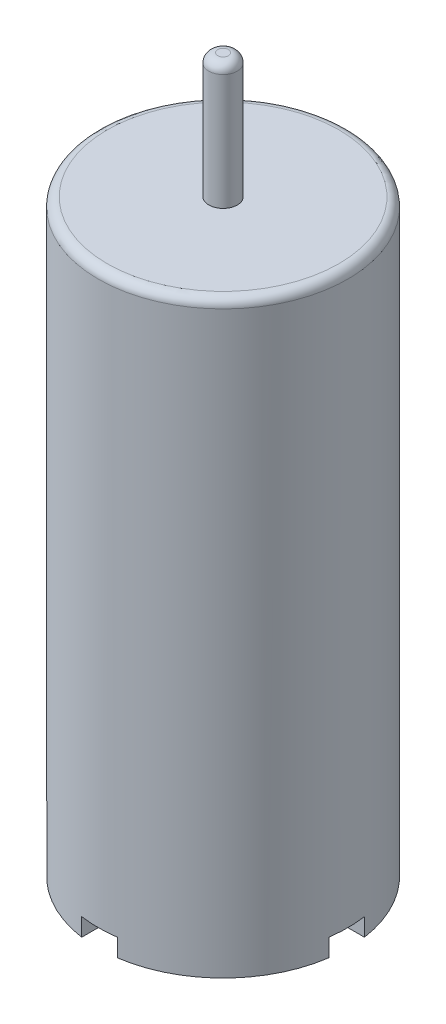
ISO-10303-21;
HEADER;
FILE_DESCRIPTION(('STEP AP214'),'2;1');
FILE_NAME('part.step','',(''),(''),'','','');
FILE_SCHEMA(('AUTOMOTIVE_DESIGN { 1 0 10303 214 1 1 1 1 }'));
ENDSEC;
DATA;
#1=APPLICATION_CONTEXT('core data for automotive mechanical design processes');
#2=APPLICATION_PROTOCOL_DEFINITION('international standard','automotive_design',2000,#1);
#3=PRODUCT_CONTEXT('',#1,'mechanical');
#4=PRODUCT('Part','Part','',(#3));
#5=PRODUCT_RELATED_PRODUCT_CATEGORY('part','',(#4));
#6=PRODUCT_DEFINITION_FORMATION('','',#4);
#7=PRODUCT_DEFINITION_CONTEXT('part definition',#1,'design');
#8=PRODUCT_DEFINITION('design','',#6,#7);
#9=PRODUCT_DEFINITION_SHAPE('','',#8);
#10=(LENGTH_UNIT() NAMED_UNIT(*) SI_UNIT(.MILLI.,.METRE.));
#11=(NAMED_UNIT(*) PLANE_ANGLE_UNIT() SI_UNIT($,.RADIAN.));
#12=(NAMED_UNIT(*) SI_UNIT($,.STERADIAN.) SOLID_ANGLE_UNIT());
#13=UNCERTAINTY_MEASURE_WITH_UNIT(LENGTH_MEASURE(1.E-05),#10,'distance_accuracy_value','');
#14=(GEOMETRIC_REPRESENTATION_CONTEXT(3) GLOBAL_UNCERTAINTY_ASSIGNED_CONTEXT((#13)) GLOBAL_UNIT_ASSIGNED_CONTEXT((#10,
#11,#12)) REPRESENTATION_CONTEXT('',''));
#15=CARTESIAN_POINT('',(0.,0.,0.));
#16=DIRECTION('',(0.,0.,1.));
#17=DIRECTION('',(1.,0.,0.));
#18=AXIS2_PLACEMENT_3D('',#15,#16,#17);
#19=CARTESIAN_POINT('',(0.,0.,0.));
#20=DIRECTION('',(0.,1.,0.));
#21=DIRECTION('',(0.,0.,1.));
#22=AXIS2_PLACEMENT_3D('',#19,#20,#21);
#23=PLANE('',#22);
#24=DIRECTION('',(0.,0.,1.));
#25=VECTOR('',#24,1.);
#26=CARTESIAN_POINT('',(-0.5,0.,2.96410161513775));
#27=LINE('',#26,#25);
#28=CARTESIAN_POINT('',(-0.5,0.,2.96410161513775));
#29=VERTEX_POINT('',#28);
#30=CARTESIAN_POINT('',(-0.5,0.,3.46410161513775));
#31=VERTEX_POINT('',#30);
#32=EDGE_CURVE('E51',#29,#31,#27,.T.);
#33=ORIENTED_EDGE('',*,*,#32,.F.);
#34=DIRECTION('',(-1.,0.,0.));
#35=VECTOR('',#34,1.);
#36=CARTESIAN_POINT('',(-0.5,0.,2.96410161513775));
#37=LINE('',#36,#35);
#38=CARTESIAN_POINT('',(0.5,0.,2.96410161513775));
#39=VERTEX_POINT('',#38);
#40=EDGE_CURVE('E55',#39,#29,#37,.T.);
#41=ORIENTED_EDGE('',*,*,#40,.F.);
#42=DIRECTION('',(0.,0.,-1.));
#43=VECTOR('',#42,1.);
#44=CARTESIAN_POINT('',(0.5,0.,2.96410161513775));
#45=LINE('',#44,#43);
#46=CARTESIAN_POINT('',(0.5,0.,3.46410161513775));
#47=VERTEX_POINT('',#46);
#48=EDGE_CURVE('E185',#47,#39,#45,.T.);
#49=ORIENTED_EDGE('',*,*,#48,.F.);
#50=CARTESIAN_POINT('',(0.,0.,0.));
#51=DIRECTION('',(0.,1.,0.));
#52=DIRECTION('',(0.,0.,1.));
#53=AXIS2_PLACEMENT_3D('',#50,#51,#52);
#54=CIRCLE('',#53,3.5);
#55=EDGE_CURVE('E170',#31,#47,#54,.T.);
#56=ORIENTED_EDGE('',*,*,#55,.F.);
#57=EDGE_LOOP('',(#33,#41,#49,#56));
#58=FACE_BOUND('',#57,.T.);
#59=ADVANCED_FACE('F36',(#58),#23,.F.);
#60=DIRECTION('',(1.,0.,0.));
#61=VECTOR('',#60,1.);
#62=CARTESIAN_POINT('',(2.96410161513776,0.,0.49999999999999));
#63=LINE('',#62,#61);
#64=CARTESIAN_POINT('',(2.96410161513776,0.,0.49999999999999));
#65=VERTEX_POINT('',#64);
#66=CARTESIAN_POINT('',(3.46410161513776,0.,0.499999999999988));
#67=VERTEX_POINT('',#66);
#68=EDGE_CURVE('E382',#65,#67,#63,.T.);
#69=ORIENTED_EDGE('',*,*,#68,.F.);
#70=DIRECTION('',(0.,0.,1.));
#71=VECTOR('',#70,1.);
#72=CARTESIAN_POINT('',(2.96410161513776,0.,0.49999999999999));
#73=LINE('',#72,#71);
#74=CARTESIAN_POINT('',(2.96410161513775,0.,-0.50000000000001));
#75=VERTEX_POINT('',#74);
#76=EDGE_CURVE('E358',#75,#65,#73,.T.);
#77=ORIENTED_EDGE('',*,*,#76,.F.);
#78=DIRECTION('',(-1.,0.,0.));
#79=VECTOR('',#78,1.);
#80=CARTESIAN_POINT('',(2.96410161513775,0.,-0.50000000000001));
#81=LINE('',#80,#79);
#82=CARTESIAN_POINT('',(3.46410161513775,0.,-0.500000000000012));
#83=VERTEX_POINT('',#82);
#84=EDGE_CURVE('E356',#83,#75,#81,.T.);
#85=ORIENTED_EDGE('',*,*,#84,.F.);
#86=EDGE_CURVE('E217',#67,#83,#54,.T.);
#87=ORIENTED_EDGE('',*,*,#86,.F.);
#88=EDGE_LOOP('',(#69,#77,#85,#87));
#89=FACE_BOUND('',#88,.T.);
#90=ADVANCED_FACE('F233',(#89),#23,.F.);
#91=DIRECTION('',(0.,0.,-1.));
#92=VECTOR('',#91,1.);
#93=CARTESIAN_POINT('',(0.49999999999998,0.,-2.96410161513776));
#94=LINE('',#93,#92);
#95=CARTESIAN_POINT('',(0.49999999999998,0.,-2.96410161513776));
#96=VERTEX_POINT('',#95);
#97=CARTESIAN_POINT('',(0.499999999999976,0.,-3.46410161513776));
#98=VERTEX_POINT('',#97);
#99=EDGE_CURVE('E341',#96,#98,#94,.T.);
#100=ORIENTED_EDGE('',*,*,#99,.F.);
#101=DIRECTION('',(1.,0.,0.));
#102=VECTOR('',#101,1.);
#103=CARTESIAN_POINT('',(0.49999999999998,0.,-2.96410161513776));
#104=LINE('',#103,#102);
#105=CARTESIAN_POINT('',(-0.500000000000021,0.,-2.96410161513775));
#106=VERTEX_POINT('',#105);
#107=EDGE_CURVE('E197',#106,#96,#104,.T.);
#108=ORIENTED_EDGE('',*,*,#107,.F.);
#109=DIRECTION('',(0.,0.,1.));
#110=VECTOR('',#109,1.);
#111=CARTESIAN_POINT('',(-0.500000000000021,0.,-2.96410161513775));
#112=LINE('',#111,#110);
#113=CARTESIAN_POINT('',(-0.500000000000024,0.,-3.46410161513775));
#114=VERTEX_POINT('',#113);
#115=EDGE_CURVE('E203',#114,#106,#112,.T.);
#116=ORIENTED_EDGE('',*,*,#115,.F.);
#117=EDGE_CURVE('E279',#98,#114,#54,.T.);
#118=ORIENTED_EDGE('',*,*,#117,.F.);
#119=EDGE_LOOP('',(#100,#108,#116,#118));
#120=FACE_BOUND('',#119,.T.);
#121=ADVANCED_FACE('F239',(#120),#23,.F.);
#122=DIRECTION('',(-1.,0.,0.));
#123=VECTOR('',#122,1.);
#124=CARTESIAN_POINT('',(-2.96410161513776,0.,-0.499999999999969));
#125=LINE('',#124,#123);
#126=CARTESIAN_POINT('',(-2.96410161513776,0.,-0.499999999999969));
#127=VERTEX_POINT('',#126);
#128=CARTESIAN_POINT('',(-3.46410161513776,0.,-0.499999999999964));
#129=VERTEX_POINT('',#128);
#130=EDGE_CURVE('E194',#127,#129,#125,.T.);
#131=ORIENTED_EDGE('',*,*,#130,.F.);
#132=DIRECTION('',(0.,0.,-1.));
#133=VECTOR('',#132,1.);
#134=CARTESIAN_POINT('',(-2.96410161513776,0.,-0.499999999999969));
#135=LINE('',#134,#133);
#136=CARTESIAN_POINT('',(-2.96410161513775,0.,0.500000000000031));
#137=VERTEX_POINT('',#136);
#138=EDGE_CURVE('E191',#137,#127,#135,.T.);
#139=ORIENTED_EDGE('',*,*,#138,.F.);
#140=DIRECTION('',(1.,0.,0.));
#141=VECTOR('',#140,1.);
#142=CARTESIAN_POINT('',(-2.96410161513775,0.,0.500000000000031));
#143=LINE('',#142,#141);
#144=CARTESIAN_POINT('',(-3.46410161513775,0.,0.500000000000036));
#145=VERTEX_POINT('',#144);
#146=EDGE_CURVE('E183',#145,#137,#143,.T.);
#147=ORIENTED_EDGE('',*,*,#146,.F.);
#148=EDGE_CURVE('E172',#129,#145,#54,.T.);
#149=ORIENTED_EDGE('',*,*,#148,.F.);
#150=EDGE_LOOP('',(#131,#139,#147,#149));
#151=FACE_BOUND('',#150,.T.);
#152=ADVANCED_FACE('F235',(#151),#23,.F.);
#153=CARTESIAN_POINT('',(0.,16.,0.));
#154=DIRECTION('',(0.,-1.,0.));
#155=DIRECTION('',(0.,0.,-1.));
#156=AXIS2_PLACEMENT_3D('',#153,#154,#155);
#157=CYLINDRICAL_SURFACE('',#156,3.5);
#158=CARTESIAN_POINT('',(0.,15.75,0.));
#159=DIRECTION('',(0.,1.,0.));
#160=DIRECTION('',(0.,0.,1.));
#161=AXIS2_PLACEMENT_3D('',#158,#159,#160);
#162=CIRCLE('',#161,3.5);
#163=CARTESIAN_POINT('',(0.,15.75,3.5));
#164=VERTEX_POINT('',#163);
#165=EDGE_CURVE('E216',#164,#164,#162,.F.);
#166=ORIENTED_EDGE('',*,*,#165,.T.);
#167=EDGE_LOOP('',(#166));
#168=FACE_BOUND('',#167,.T.);
#169=ORIENTED_EDGE('',*,*,#55,.T.);
#170=DIRECTION('',(0.,1.,0.));
#171=VECTOR('',#170,1.);
#172=CARTESIAN_POINT('',(0.5,-0.5,3.46410161513775));
#173=LINE('',#172,#171);
#174=CARTESIAN_POINT('',(0.5,-0.5,3.46410161513775));
#175=VERTEX_POINT('',#174);
#176=EDGE_CURVE('E313',#175,#47,#173,.T.);
#177=ORIENTED_EDGE('',*,*,#176,.F.);
#178=CARTESIAN_POINT('',(0.,-0.5,0.));
#179=DIRECTION('',(0.,-1.,0.));
#180=DIRECTION('',(0.,0.,-1.));
#181=AXIS2_PLACEMENT_3D('',#178,#179,#180);
#182=CIRCLE('',#181,3.5);
#183=CARTESIAN_POINT('',(3.46410161513776,-0.5,0.499999999999988));
#184=VERTEX_POINT('',#183);
#185=EDGE_CURVE('E305',#184,#175,#182,.T.);
#186=ORIENTED_EDGE('',*,*,#185,.F.);
#187=DIRECTION('',(0.,1.,0.));
#188=VECTOR('',#187,1.);
#189=CARTESIAN_POINT('',(3.46410161513776,-0.5,0.499999999999988));
#190=LINE('',#189,#188);
#191=EDGE_CURVE('E322',#184,#67,#190,.T.);
#192=ORIENTED_EDGE('',*,*,#191,.T.);
#193=ORIENTED_EDGE('',*,*,#86,.T.);
#194=DIRECTION('',(0.,1.,0.));
#195=VECTOR('',#194,1.);
#196=CARTESIAN_POINT('',(3.46410161513775,-0.5,-0.500000000000012));
#197=LINE('',#196,#195);
#198=CARTESIAN_POINT('',(3.46410161513775,-0.5,-0.500000000000012));
#199=VERTEX_POINT('',#198);
#200=EDGE_CURVE('E324',#199,#83,#197,.T.);
#201=ORIENTED_EDGE('',*,*,#200,.F.);
#202=CARTESIAN_POINT('',(0.,-0.5,0.));
#203=DIRECTION('',(0.,-1.,0.));
#204=DIRECTION('',(0.,0.,-1.));
#205=AXIS2_PLACEMENT_3D('',#202,#203,#204);
#206=CIRCLE('',#205,3.5);
#207=CARTESIAN_POINT('',(0.499999999999976,-0.5,-3.46410161513776));
#208=VERTEX_POINT('',#207);
#209=EDGE_CURVE('E297',#208,#199,#206,.T.);
#210=ORIENTED_EDGE('',*,*,#209,.F.);
#211=DIRECTION('',(0.,1.,0.));
#212=VECTOR('',#211,1.);
#213=CARTESIAN_POINT('',(0.499999999999976,-0.5,-3.46410161513776));
#214=LINE('',#213,#212);
#215=EDGE_CURVE('E327',#208,#98,#214,.T.);
#216=ORIENTED_EDGE('',*,*,#215,.T.);
#217=ORIENTED_EDGE('',*,*,#117,.T.);
#218=DIRECTION('',(0.,1.,0.));
#219=VECTOR('',#218,1.);
#220=CARTESIAN_POINT('',(-0.500000000000024,-0.5,-3.46410161513775));
#221=LINE('',#220,#219);
#222=CARTESIAN_POINT('',(-0.500000000000024,-0.5,-3.46410161513775));
#223=VERTEX_POINT('',#222);
#224=EDGE_CURVE('E210',#223,#114,#221,.T.);
#225=ORIENTED_EDGE('',*,*,#224,.F.);
#226=CARTESIAN_POINT('',(0.,-0.5,0.));
#227=DIRECTION('',(0.,-1.,0.));
#228=DIRECTION('',(0.,0.,-1.));
#229=AXIS2_PLACEMENT_3D('',#226,#227,#228);
#230=CIRCLE('',#229,3.5);
#231=CARTESIAN_POINT('',(-3.46410161513776,-0.5,-0.499999999999964));
#232=VERTEX_POINT('',#231);
#233=EDGE_CURVE('E289',#232,#223,#230,.T.);
#234=ORIENTED_EDGE('',*,*,#233,.F.);
#235=DIRECTION('',(0.,1.,0.));
#236=VECTOR('',#235,1.);
#237=CARTESIAN_POINT('',(-3.46410161513776,-0.5,-0.499999999999964));
#238=LINE('',#237,#236);
#239=EDGE_CURVE('E206',#232,#129,#238,.T.);
#240=ORIENTED_EDGE('',*,*,#239,.T.);
#241=ORIENTED_EDGE('',*,*,#148,.T.);
#242=DIRECTION('',(0.,1.,0.));
#243=VECTOR('',#242,1.);
#244=CARTESIAN_POINT('',(-3.46410161513775,-0.5,0.500000000000036));
#245=LINE('',#244,#243);
#246=CARTESIAN_POINT('',(-3.46410161513775,-0.5,0.500000000000036));
#247=VERTEX_POINT('',#246);
#248=EDGE_CURVE('E155',#247,#145,#245,.T.);
#249=ORIENTED_EDGE('',*,*,#248,.F.);
#250=CARTESIAN_POINT('',(0.,-0.5,0.));
#251=DIRECTION('',(0.,-1.,0.));
#252=DIRECTION('',(0.,0.,-1.));
#253=AXIS2_PLACEMENT_3D('',#250,#251,#252);
#254=CIRCLE('',#253,3.5);
#255=CARTESIAN_POINT('',(-0.5,-0.5,3.46410161513776));
#256=VERTEX_POINT('',#255);
#257=EDGE_CURVE('E147',#256,#247,#254,.T.);
#258=ORIENTED_EDGE('',*,*,#257,.F.);
#259=DIRECTION('',(0.,1.,0.));
#260=VECTOR('',#259,1.);
#261=CARTESIAN_POINT('',(-0.5,-0.5,3.46410161513776));
#262=LINE('',#261,#260);
#263=EDGE_CURVE('E152',#256,#31,#262,.T.);
#264=ORIENTED_EDGE('',*,*,#263,.T.);
#265=EDGE_LOOP('',(#169,#177,#186,#192,#193,#201,#210,#216,#217,#225,#234,#240,#241,#249,#258,#264));
#266=FACE_BOUND('',#265,.T.);
#267=ADVANCED_FACE('F150',(#168,#266),#157,.T.);
#268=CARTESIAN_POINT('',(0.,16.,0.));
#269=DIRECTION('',(0.,1.,0.));
#270=DIRECTION('',(0.,0.,1.));
#271=AXIS2_PLACEMENT_3D('',#268,#269,#270);
#272=PLANE('',#271);
#273=CARTESIAN_POINT('',(0.,16.,0.));
#274=DIRECTION('',(0.,1.,0.));
#275=DIRECTION('',(0.,0.,1.));
#276=AXIS2_PLACEMENT_3D('',#273,#274,#275);
#277=CIRCLE('',#276,3.25);
#278=CARTESIAN_POINT('',(0.,16.,3.25));
#279=VERTEX_POINT('',#278);
#280=EDGE_CURVE('E213',#279,#279,#277,.T.);
#281=ORIENTED_EDGE('',*,*,#280,.T.);
#282=EDGE_LOOP('',(#281));
#283=FACE_BOUND('',#282,.T.);
#284=CARTESIAN_POINT('',(0.,16.,0.));
#285=DIRECTION('',(0.,1.,0.));
#286=DIRECTION('',(0.,0.,1.));
#287=AXIS2_PLACEMENT_3D('',#284,#285,#286);
#288=CIRCLE('',#287,0.4);
#289=CARTESIAN_POINT('',(0.,16.,0.4));
#290=VERTEX_POINT('',#289);
#291=EDGE_CURVE('E184',#290,#290,#288,.T.);
#292=ORIENTED_EDGE('',*,*,#291,.F.);
#293=EDGE_LOOP('',(#292));
#294=FACE_BOUND('',#293,.T.);
#295=ADVANCED_FACE('F249',(#283,#294),#272,.T.);
#296=CARTESIAN_POINT('',(-0.5,-0.5,2.96410161513775));
#297=DIRECTION('',(-1.,0.,0.));
#298=DIRECTION('',(0.,0.,1.));
#299=AXIS2_PLACEMENT_3D('',#296,#297,#298);
#300=PLANE('',#299);
#301=ORIENTED_EDGE('',*,*,#32,.T.);
#302=ORIENTED_EDGE('',*,*,#263,.F.);
#303=DIRECTION('',(0.,0.,1.));
#304=VECTOR('',#303,1.);
#305=CARTESIAN_POINT('',(-0.5,-0.5,2.96410161513775));
#306=LINE('',#305,#304);
#307=CARTESIAN_POINT('',(-0.5,-0.5,2.96410161513775));
#308=VERTEX_POINT('',#307);
#309=EDGE_CURVE('E159',#308,#256,#306,.T.);
#310=ORIENTED_EDGE('',*,*,#309,.F.);
#311=DIRECTION('',(0.,1.,0.));
#312=VECTOR('',#311,1.);
#313=CARTESIAN_POINT('',(-0.5,-0.5,2.96410161513775));
#314=LINE('',#313,#312);
#315=EDGE_CURVE('E309',#308,#29,#314,.T.);
#316=ORIENTED_EDGE('',*,*,#315,.T.);
#317=EDGE_LOOP('',(#301,#302,#310,#316));
#318=FACE_BOUND('',#317,.T.);
#319=ADVANCED_FACE('F169',(#318),#300,.F.);
#320=CARTESIAN_POINT('',(-2.96410161513775,-0.5,0.500000000000031));
#321=DIRECTION('',(0.,0.,1.));
#322=DIRECTION('',(1.,0.,0.));
#323=AXIS2_PLACEMENT_3D('',#320,#321,#322);
#324=PLANE('',#323);
#325=ORIENTED_EDGE('',*,*,#146,.T.);
#326=DIRECTION('',(0.,1.,0.));
#327=VECTOR('',#326,1.);
#328=CARTESIAN_POINT('',(-2.96410161513775,-0.5,0.500000000000031));
#329=LINE('',#328,#327);
#330=CARTESIAN_POINT('',(-2.96410161513775,-0.5,0.500000000000031));
#331=VERTEX_POINT('',#330);
#332=EDGE_CURVE('E174',#331,#137,#329,.T.);
#333=ORIENTED_EDGE('',*,*,#332,.F.);
#334=DIRECTION('',(1.,0.,0.));
#335=VECTOR('',#334,1.);
#336=CARTESIAN_POINT('',(-2.96410161513775,-0.5,0.500000000000031));
#337=LINE('',#336,#335);
#338=EDGE_CURVE('E158',#247,#331,#337,.T.);
#339=ORIENTED_EDGE('',*,*,#338,.F.);
#340=ORIENTED_EDGE('',*,*,#248,.T.);
#341=EDGE_LOOP('',(#325,#333,#339,#340));
#342=FACE_BOUND('',#341,.T.);
#343=ADVANCED_FACE('F283',(#342),#324,.F.);
#344=CARTESIAN_POINT('',(-2.96410161513776,-0.5,-0.499999999999969));
#345=DIRECTION('',(1.,0.,0.));
#346=DIRECTION('',(0.,0.,-1.));
#347=AXIS2_PLACEMENT_3D('',#344,#345,#346);
#348=PLANE('',#347);
#349=ORIENTED_EDGE('',*,*,#138,.T.);
#350=DIRECTION('',(0.,1.,0.));
#351=VECTOR('',#350,1.);
#352=CARTESIAN_POINT('',(-2.96410161513776,-0.5,-0.499999999999969));
#353=LINE('',#352,#351);
#354=CARTESIAN_POINT('',(-2.96410161513776,-0.5,-0.499999999999969));
#355=VERTEX_POINT('',#354);
#356=EDGE_CURVE('E209',#355,#127,#353,.T.);
#357=ORIENTED_EDGE('',*,*,#356,.F.);
#358=DIRECTION('',(0.,0.,-1.));
#359=VECTOR('',#358,1.);
#360=CARTESIAN_POINT('',(-2.96410161513776,-0.5,-0.499999999999969));
#361=LINE('',#360,#359);
#362=EDGE_CURVE('E284',#331,#355,#361,.T.);
#363=ORIENTED_EDGE('',*,*,#362,.F.);
#364=ORIENTED_EDGE('',*,*,#332,.T.);
#365=EDGE_LOOP('',(#349,#357,#363,#364));
#366=FACE_BOUND('',#365,.T.);
#367=ADVANCED_FACE('F259',(#366),#348,.F.);
#368=CARTESIAN_POINT('',(-2.96410161513776,-0.5,-0.499999999999969));
#369=DIRECTION('',(0.,0.,-1.));
#370=DIRECTION('',(-1.,0.,0.));
#371=AXIS2_PLACEMENT_3D('',#368,#369,#370);
#372=PLANE('',#371);
#373=ORIENTED_EDGE('',*,*,#130,.T.);
#374=ORIENTED_EDGE('',*,*,#239,.F.);
#375=DIRECTION('',(-1.,0.,0.));
#376=VECTOR('',#375,1.);
#377=CARTESIAN_POINT('',(-2.96410161513776,-0.5,-0.499999999999969));
#378=LINE('',#377,#376);
#379=EDGE_CURVE('E264',#355,#232,#378,.T.);
#380=ORIENTED_EDGE('',*,*,#379,.F.);
#381=ORIENTED_EDGE('',*,*,#356,.T.);
#382=EDGE_LOOP('',(#373,#374,#380,#381));
#383=FACE_BOUND('',#382,.T.);
#384=ADVANCED_FACE('F263',(#383),#372,.F.);
#385=CARTESIAN_POINT('',(-0.500000000000021,-0.5,-2.96410161513775));
#386=DIRECTION('',(-1.,0.,0.));
#387=DIRECTION('',(0.,0.,1.));
#388=AXIS2_PLACEMENT_3D('',#385,#386,#387);
#389=PLANE('',#388);
#390=ORIENTED_EDGE('',*,*,#115,.T.);
#391=DIRECTION('',(0.,1.,0.));
#392=VECTOR('',#391,1.);
#393=CARTESIAN_POINT('',(-0.500000000000021,-0.5,-2.96410161513775));
#394=LINE('',#393,#392);
#395=CARTESIAN_POINT('',(-0.500000000000021,-0.5,-2.96410161513775));
#396=VERTEX_POINT('',#395);
#397=EDGE_CURVE('E268',#396,#106,#394,.T.);
#398=ORIENTED_EDGE('',*,*,#397,.F.);
#399=DIRECTION('',(0.,0.,1.));
#400=VECTOR('',#399,1.);
#401=CARTESIAN_POINT('',(-0.500000000000021,-0.5,-2.96410161513775));
#402=LINE('',#401,#400);
#403=EDGE_CURVE('E291',#223,#396,#402,.T.);
#404=ORIENTED_EDGE('',*,*,#403,.F.);
#405=ORIENTED_EDGE('',*,*,#224,.T.);
#406=EDGE_LOOP('',(#390,#398,#404,#405));
#407=FACE_BOUND('',#406,.T.);
#408=ADVANCED_FACE('F352',(#407),#389,.F.);
#409=CARTESIAN_POINT('',(0.49999999999998,-0.5,-2.96410161513776));
#410=DIRECTION('',(0.,0.,1.));
#411=DIRECTION('',(1.,0.,0.));
#412=AXIS2_PLACEMENT_3D('',#409,#410,#411);
#413=PLANE('',#412);
#414=ORIENTED_EDGE('',*,*,#107,.T.);
#415=DIRECTION('',(0.,1.,0.));
#416=VECTOR('',#415,1.);
#417=CARTESIAN_POINT('',(0.49999999999998,-0.5,-2.96410161513776));
#418=LINE('',#417,#416);
#419=CARTESIAN_POINT('',(0.49999999999998,-0.5,-2.96410161513776));
#420=VERTEX_POINT('',#419);
#421=EDGE_CURVE('E325',#420,#96,#418,.T.);
#422=ORIENTED_EDGE('',*,*,#421,.F.);
#423=DIRECTION('',(1.,0.,0.));
#424=VECTOR('',#423,1.);
#425=CARTESIAN_POINT('',(0.49999999999998,-0.5,-2.96410161513776));
#426=LINE('',#425,#424);
#427=EDGE_CURVE('E293',#396,#420,#426,.T.);
#428=ORIENTED_EDGE('',*,*,#427,.F.);
#429=ORIENTED_EDGE('',*,*,#397,.T.);
#430=EDGE_LOOP('',(#414,#422,#428,#429));
#431=FACE_BOUND('',#430,.T.);
#432=ADVANCED_FACE('F361',(#431),#413,.F.);
#433=CARTESIAN_POINT('',(0.49999999999998,-0.5,-2.96410161513776));
#434=DIRECTION('',(1.,0.,0.));
#435=DIRECTION('',(0.,0.,-1.));
#436=AXIS2_PLACEMENT_3D('',#433,#434,#435);
#437=PLANE('',#436);
#438=ORIENTED_EDGE('',*,*,#99,.T.);
#439=ORIENTED_EDGE('',*,*,#215,.F.);
#440=DIRECTION('',(0.,0.,-1.));
#441=VECTOR('',#440,1.);
#442=CARTESIAN_POINT('',(0.49999999999998,-0.5,-2.96410161513776));
#443=LINE('',#442,#441);
#444=EDGE_CURVE('E295',#420,#208,#443,.T.);
#445=ORIENTED_EDGE('',*,*,#444,.F.);
#446=ORIENTED_EDGE('',*,*,#421,.T.);
#447=EDGE_LOOP('',(#438,#439,#445,#446));
#448=FACE_BOUND('',#447,.T.);
#449=ADVANCED_FACE('F355',(#448),#437,.F.);
#450=CARTESIAN_POINT('',(2.96410161513775,-0.5,-0.50000000000001));
#451=DIRECTION('',(0.,0.,-1.));
#452=DIRECTION('',(-1.,0.,0.));
#453=AXIS2_PLACEMENT_3D('',#450,#451,#452);
#454=PLANE('',#453);
#455=ORIENTED_EDGE('',*,*,#84,.T.);
#456=DIRECTION('',(0.,1.,0.));
#457=VECTOR('',#456,1.);
#458=CARTESIAN_POINT('',(2.96410161513775,-0.5,-0.50000000000001));
#459=LINE('',#458,#457);
#460=CARTESIAN_POINT('',(2.96410161513775,-0.5,-0.50000000000001));
#461=VERTEX_POINT('',#460);
#462=EDGE_CURVE('E321',#461,#75,#459,.T.);
#463=ORIENTED_EDGE('',*,*,#462,.F.);
#464=DIRECTION('',(-1.,0.,0.));
#465=VECTOR('',#464,1.);
#466=CARTESIAN_POINT('',(2.96410161513775,-0.5,-0.50000000000001));
#467=LINE('',#466,#465);
#468=EDGE_CURVE('E299',#199,#461,#467,.T.);
#469=ORIENTED_EDGE('',*,*,#468,.F.);
#470=ORIENTED_EDGE('',*,*,#200,.T.);
#471=EDGE_LOOP('',(#455,#463,#469,#470));
#472=FACE_BOUND('',#471,.T.);
#473=ADVANCED_FACE('F369',(#472),#454,.F.);
#474=CARTESIAN_POINT('',(2.96410161513776,-0.5,0.49999999999999));
#475=DIRECTION('',(-1.,0.,0.));
#476=DIRECTION('',(0.,0.,1.));
#477=AXIS2_PLACEMENT_3D('',#474,#475,#476);
#478=PLANE('',#477);
#479=ORIENTED_EDGE('',*,*,#76,.T.);
#480=DIRECTION('',(0.,1.,0.));
#481=VECTOR('',#480,1.);
#482=CARTESIAN_POINT('',(2.96410161513776,-0.5,0.49999999999999));
#483=LINE('',#482,#481);
#484=CARTESIAN_POINT('',(2.96410161513776,-0.5,0.49999999999999));
#485=VERTEX_POINT('',#484);
#486=EDGE_CURVE('E318',#485,#65,#483,.T.);
#487=ORIENTED_EDGE('',*,*,#486,.F.);
#488=DIRECTION('',(0.,0.,1.));
#489=VECTOR('',#488,1.);
#490=CARTESIAN_POINT('',(2.96410161513776,-0.5,0.49999999999999));
#491=LINE('',#490,#489);
#492=EDGE_CURVE('E301',#461,#485,#491,.T.);
#493=ORIENTED_EDGE('',*,*,#492,.F.);
#494=ORIENTED_EDGE('',*,*,#462,.T.);
#495=EDGE_LOOP('',(#479,#487,#493,#494));
#496=FACE_BOUND('',#495,.T.);
#497=ADVANCED_FACE('F374',(#496),#478,.F.);
#498=CARTESIAN_POINT('',(2.96410161513776,-0.5,0.49999999999999));
#499=DIRECTION('',(0.,0.,1.));
#500=DIRECTION('',(1.,0.,0.));
#501=AXIS2_PLACEMENT_3D('',#498,#499,#500);
#502=PLANE('',#501);
#503=ORIENTED_EDGE('',*,*,#68,.T.);
#504=ORIENTED_EDGE('',*,*,#191,.F.);
#505=DIRECTION('',(1.,0.,0.));
#506=VECTOR('',#505,1.);
#507=CARTESIAN_POINT('',(2.96410161513776,-0.5,0.49999999999999));
#508=LINE('',#507,#506);
#509=EDGE_CURVE('E303',#485,#184,#508,.T.);
#510=ORIENTED_EDGE('',*,*,#509,.F.);
#511=ORIENTED_EDGE('',*,*,#486,.T.);
#512=EDGE_LOOP('',(#503,#504,#510,#511));
#513=FACE_BOUND('',#512,.T.);
#514=ADVANCED_FACE('F381',(#513),#502,.F.);
#515=CARTESIAN_POINT('',(0.5,-0.5,2.96410161513775));
#516=DIRECTION('',(1.,0.,0.));
#517=DIRECTION('',(0.,0.,-1.));
#518=AXIS2_PLACEMENT_3D('',#515,#516,#517);
#519=PLANE('',#518);
#520=ORIENTED_EDGE('',*,*,#48,.T.);
#521=DIRECTION('',(0.,1.,0.));
#522=VECTOR('',#521,1.);
#523=CARTESIAN_POINT('',(0.5,-0.5,2.96410161513775));
#524=LINE('',#523,#522);
#525=CARTESIAN_POINT('',(0.5,-0.5,2.96410161513775));
#526=VERTEX_POINT('',#525);
#527=EDGE_CURVE('E310',#526,#39,#524,.T.);
#528=ORIENTED_EDGE('',*,*,#527,.F.);
#529=DIRECTION('',(0.,0.,-1.));
#530=VECTOR('',#529,1.);
#531=CARTESIAN_POINT('',(0.5,-0.5,2.96410161513775));
#532=LINE('',#531,#530);
#533=EDGE_CURVE('E306',#175,#526,#532,.T.);
#534=ORIENTED_EDGE('',*,*,#533,.F.);
#535=ORIENTED_EDGE('',*,*,#176,.T.);
#536=EDGE_LOOP('',(#520,#528,#534,#535));
#537=FACE_BOUND('',#536,.T.);
#538=ADVANCED_FACE('F387',(#537),#519,.F.);
#539=CARTESIAN_POINT('',(-0.5,-0.5,2.96410161513775));
#540=DIRECTION('',(0.,0.,-1.));
#541=DIRECTION('',(-1.,0.,0.));
#542=AXIS2_PLACEMENT_3D('',#539,#540,#541);
#543=PLANE('',#542);
#544=ORIENTED_EDGE('',*,*,#40,.T.);
#545=ORIENTED_EDGE('',*,*,#315,.F.);
#546=DIRECTION('',(-1.,0.,0.));
#547=VECTOR('',#546,1.);
#548=CARTESIAN_POINT('',(-0.5,-0.5,2.96410161513775));
#549=LINE('',#548,#547);
#550=EDGE_CURVE('E164',#526,#308,#549,.T.);
#551=ORIENTED_EDGE('',*,*,#550,.F.);
#552=ORIENTED_EDGE('',*,*,#527,.T.);
#553=EDGE_LOOP('',(#544,#545,#551,#552));
#554=FACE_BOUND('',#553,.T.);
#555=ADVANCED_FACE('F389',(#554),#543,.F.);
#556=CARTESIAN_POINT('',(0.,-0.5,0.));
#557=DIRECTION('',(0.,-1.,0.));
#558=DIRECTION('',(0.,0.,-1.));
#559=AXIS2_PLACEMENT_3D('',#556,#557,#558);
#560=PLANE('',#559);
#561=ORIENTED_EDGE('',*,*,#309,.T.);
#562=ORIENTED_EDGE('',*,*,#257,.T.);
#563=ORIENTED_EDGE('',*,*,#338,.T.);
#564=ORIENTED_EDGE('',*,*,#362,.T.);
#565=ORIENTED_EDGE('',*,*,#379,.T.);
#566=ORIENTED_EDGE('',*,*,#233,.T.);
#567=ORIENTED_EDGE('',*,*,#403,.T.);
#568=ORIENTED_EDGE('',*,*,#427,.T.);
#569=ORIENTED_EDGE('',*,*,#444,.T.);
#570=ORIENTED_EDGE('',*,*,#209,.T.);
#571=ORIENTED_EDGE('',*,*,#468,.T.);
#572=ORIENTED_EDGE('',*,*,#492,.T.);
#573=ORIENTED_EDGE('',*,*,#509,.T.);
#574=ORIENTED_EDGE('',*,*,#185,.T.);
#575=ORIENTED_EDGE('',*,*,#533,.T.);
#576=ORIENTED_EDGE('',*,*,#550,.T.);
#577=EDGE_LOOP('',(#561,#562,#563,#564,#565,#566,#567,#568,#569,#570,#571,#572,#573,#574,#575,#576));
#578=FACE_BOUND('',#577,.T.);
#579=ADVANCED_FACE('F162',(#578),#560,.T.);
#580=CARTESIAN_POINT('',(0.,19.5,0.));
#581=DIRECTION('',(0.,-1.,0.));
#582=DIRECTION('',(0.,0.,-1.));
#583=AXIS2_PLACEMENT_3D('',#580,#581,#582);
#584=CYLINDRICAL_SURFACE('',#583,0.4);
#585=CARTESIAN_POINT('',(0.,19.25,0.));
#586=DIRECTION('',(0.,1.,0.));
#587=DIRECTION('',(0.,0.,1.));
#588=AXIS2_PLACEMENT_3D('',#585,#586,#587);
#589=CIRCLE('',#588,0.4);
#590=CARTESIAN_POINT('',(0.,19.25,0.4));
#591=VERTEX_POINT('',#590);
#592=EDGE_CURVE('E11',#591,#591,#589,.F.);
#593=ORIENTED_EDGE('',*,*,#592,.T.);
#594=EDGE_LOOP('',(#593));
#595=FACE_BOUND('',#594,.T.);
#596=ORIENTED_EDGE('',*,*,#291,.T.);
#597=EDGE_LOOP('',(#596));
#598=FACE_BOUND('',#597,.T.);
#599=ADVANCED_FACE('F408',(#595,#598),#584,.T.);
#600=CARTESIAN_POINT('',(0.,19.5,0.));
#601=DIRECTION('',(0.,1.,0.));
#602=DIRECTION('',(0.,0.,1.));
#603=AXIS2_PLACEMENT_3D('',#600,#601,#602);
#604=PLANE('',#603);
#605=CARTESIAN_POINT('',(0.,19.5,0.));
#606=DIRECTION('',(0.,1.,0.));
#607=DIRECTION('',(0.,0.,1.));
#608=AXIS2_PLACEMENT_3D('',#605,#606,#607);
#609=CIRCLE('',#608,0.15);
#610=CARTESIAN_POINT('',(0.,19.5,0.15));
#611=VERTEX_POINT('',#610);
#612=EDGE_CURVE('E44',#611,#611,#609,.T.);
#613=ORIENTED_EDGE('',*,*,#612,.T.);
#614=EDGE_LOOP('',(#613));
#615=FACE_BOUND('',#614,.T.);
#616=ADVANCED_FACE('F222',(#615),#604,.T.);
#617=CARTESIAN_POINT('',(0.,15.75,0.));
#618=DIRECTION('',(0.,1.,0.));
#619=DIRECTION('',(0.,0.,1.));
#620=AXIS2_PLACEMENT_3D('',#617,#618,#619);
#621=TOROIDAL_SURFACE('',#620,3.25,0.25);
#622=ORIENTED_EDGE('',*,*,#165,.F.);
#623=EDGE_LOOP('',(#622));
#624=FACE_BOUND('',#623,.T.);
#625=ORIENTED_EDGE('',*,*,#280,.F.);
#626=EDGE_LOOP('',(#625));
#627=FACE_BOUND('',#626,.T.);
#628=ADVANCED_FACE('F225',(#624,#627),#621,.T.);
#629=CARTESIAN_POINT('',(0.,19.25,0.));
#630=DIRECTION('',(0.,1.,0.));
#631=DIRECTION('',(0.,0.,1.));
#632=AXIS2_PLACEMENT_3D('',#629,#630,#631);
#633=DEGENERATE_TOROIDAL_SURFACE('',#632,0.15,0.25,.T.);
#634=ORIENTED_EDGE('',*,*,#592,.F.);
#635=EDGE_LOOP('',(#634));
#636=FACE_BOUND('',#635,.T.);
#637=ORIENTED_EDGE('',*,*,#612,.F.);
#638=EDGE_LOOP('',(#637));
#639=FACE_BOUND('',#638,.T.);
#640=ADVANCED_FACE('F38',(#636,#639),#633,.T.);
#641=CLOSED_SHELL('',(#59,#90,#121,#152,#267,#295,#319,#343,#367,#384,#408,#432,#449,#473,#497,
#514,#538,#555,#579,#599,#616,#628,#640));
#642=MANIFOLD_SOLID_BREP('B2',#641);
#643=ADVANCED_BREP_SHAPE_REPRESENTATION('',(#18,#642),#14);
#644=SHAPE_DEFINITION_REPRESENTATION(#9,#643);
ENDSEC;
END-ISO-10303-21;
